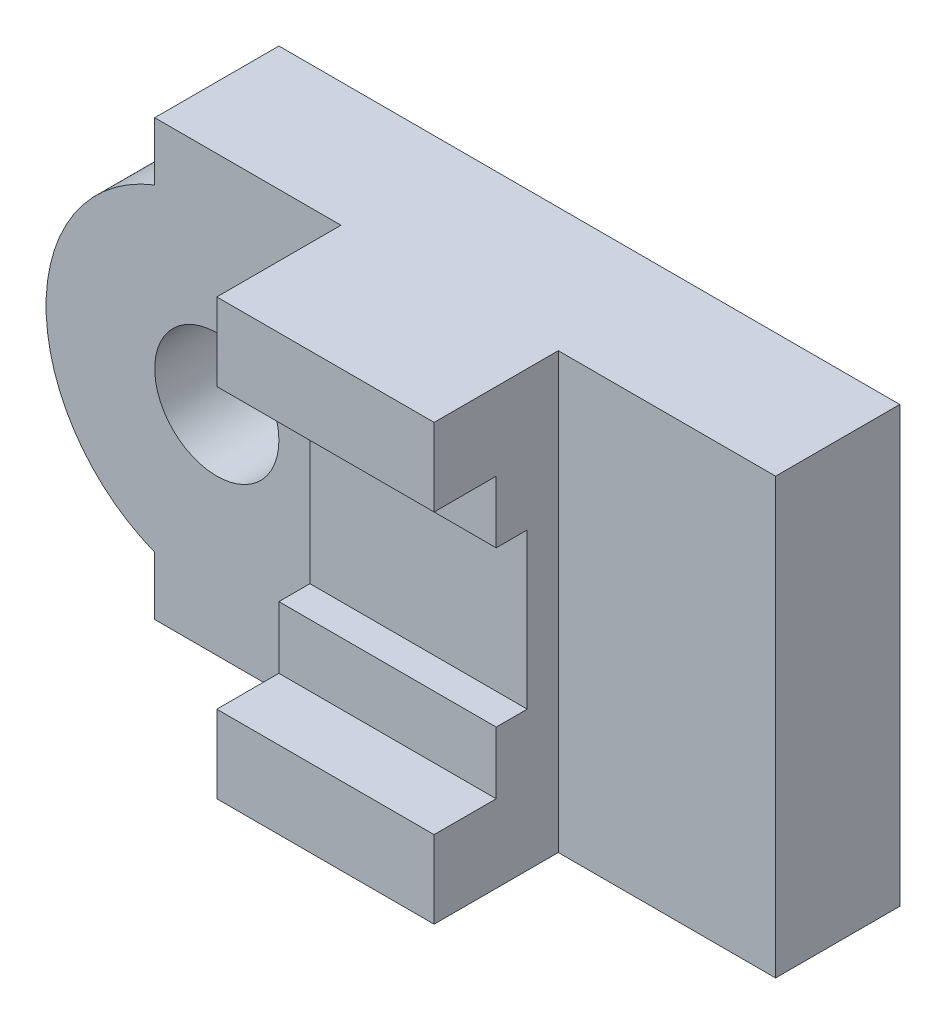
ISO-10303-21;
HEADER;
FILE_DESCRIPTION(('STEP AP214'),'2;1');
FILE_NAME('part.step','',(''),(''),'','','');
FILE_SCHEMA(('AUTOMOTIVE_DESIGN { 1 0 10303 214 1 1 1 1 }'));
ENDSEC;
DATA;
#1=APPLICATION_CONTEXT('core data for automotive mechanical design processes');
#2=APPLICATION_PROTOCOL_DEFINITION('international standard','automotive_design',2000,#1);
#3=PRODUCT_CONTEXT('',#1,'mechanical');
#4=PRODUCT('Part','Part','',(#3));
#5=PRODUCT_RELATED_PRODUCT_CATEGORY('part','',(#4));
#6=PRODUCT_DEFINITION_FORMATION('','',#4);
#7=PRODUCT_DEFINITION_CONTEXT('part definition',#1,'design');
#8=PRODUCT_DEFINITION('design','',#6,#7);
#9=PRODUCT_DEFINITION_SHAPE('','',#8);
#10=(LENGTH_UNIT() NAMED_UNIT(*) SI_UNIT(.MILLI.,.METRE.));
#11=(NAMED_UNIT(*) PLANE_ANGLE_UNIT() SI_UNIT($,.RADIAN.));
#12=(NAMED_UNIT(*) SI_UNIT($,.STERADIAN.) SOLID_ANGLE_UNIT());
#13=UNCERTAINTY_MEASURE_WITH_UNIT(LENGTH_MEASURE(1.E-05),#10,'distance_accuracy_value','');
#14=(GEOMETRIC_REPRESENTATION_CONTEXT(3) GLOBAL_UNCERTAINTY_ASSIGNED_CONTEXT((#13)) GLOBAL_UNIT_ASSIGNED_CONTEXT((#10,
#11,#12)) REPRESENTATION_CONTEXT('',''));
#15=CARTESIAN_POINT('',(0.,0.,0.));
#16=DIRECTION('',(0.,0.,1.));
#17=DIRECTION('',(1.,0.,0.));
#18=AXIS2_PLACEMENT_3D('',#15,#16,#17);
#19=CARTESIAN_POINT('',(0.,0.,20.));
#20=DIRECTION('',(0.,0.,1.));
#21=DIRECTION('',(1.,0.,0.));
#22=AXIS2_PLACEMENT_3D('',#19,#20,#21);
#23=PLANE('',#22);
#24=DIRECTION('',(1.,0.,0.));
#25=VECTOR('',#24,1.);
#26=CARTESIAN_POINT('',(0.,35.,20.));
#27=LINE('',#26,#25);
#28=CARTESIAN_POINT('',(15.,35.,20.));
#29=VERTEX_POINT('',#28);
#30=CARTESIAN_POINT('',(50.,35.,20.));
#31=VERTEX_POINT('',#30);
#32=EDGE_CURVE('E50',#29,#31,#27,.T.);
#33=ORIENTED_EDGE('',*,*,#32,.F.);
#34=DIRECTION('',(0.,-1.,0.));
#35=VECTOR('',#34,1.);
#36=CARTESIAN_POINT('',(15.,0.,20.));
#37=LINE('',#36,#35);
#38=CARTESIAN_POINT('',(15.,-35.,20.));
#39=VERTEX_POINT('',#38);
#40=EDGE_CURVE('E246',#29,#39,#37,.T.);
#41=ORIENTED_EDGE('',*,*,#40,.T.);
#42=DIRECTION('',(1.,0.,0.));
#43=VECTOR('',#42,1.);
#44=CARTESIAN_POINT('',(0.,-35.,20.));
#45=LINE('',#44,#43);
#46=CARTESIAN_POINT('',(50.,-35.,20.));
#47=VERTEX_POINT('',#46);
#48=EDGE_CURVE('E259',#39,#47,#45,.T.);
#49=ORIENTED_EDGE('',*,*,#48,.T.);
#50=DIRECTION('',(0.,1.,0.));
#51=VECTOR('',#50,1.);
#52=CARTESIAN_POINT('',(50.,0.,20.));
#53=LINE('',#52,#51);
#54=EDGE_CURVE('E258',#47,#31,#53,.T.);
#55=ORIENTED_EDGE('',*,*,#54,.T.);
#56=EDGE_LOOP('',(#33,#41,#49,#55));
#57=FACE_BOUND('',#56,.T.);
#58=ADVANCED_FACE('F35',(#57),#23,.T.);
#59=CARTESIAN_POINT('',(-50.,0.,20.));
#60=DIRECTION('',(-1.,0.,0.));
#61=DIRECTION('',(0.,0.,1.));
#62=AXIS2_PLACEMENT_3D('',#59,#60,#61);
#63=PLANE('',#62);
#64=DIRECTION('',(0.,1.,0.));
#65=VECTOR('',#64,1.);
#66=CARTESIAN_POINT('',(-50.,0.,0.));
#67=LINE('',#66,#65);
#68=CARTESIAN_POINT('',(-50.,25.617376914899,0.));
#69=VERTEX_POINT('',#68);
#70=CARTESIAN_POINT('',(-50.,35.,0.));
#71=VERTEX_POINT('',#70);
#72=EDGE_CURVE('E248',#69,#71,#67,.T.);
#73=ORIENTED_EDGE('',*,*,#72,.F.);
#74=DIRECTION('',(0.,0.,-1.));
#75=VECTOR('',#74,1.);
#76=CARTESIAN_POINT('',(-50.,25.617376914899,20.));
#77=LINE('',#76,#75);
#78=CARTESIAN_POINT('',(-50.,25.617376914899,20.));
#79=VERTEX_POINT('',#78);
#80=EDGE_CURVE('E11',#79,#69,#77,.T.);
#81=ORIENTED_EDGE('',*,*,#80,.F.);
#82=DIRECTION('',(0.,1.,0.));
#83=VECTOR('',#82,1.);
#84=CARTESIAN_POINT('',(-50.,0.,20.));
#85=LINE('',#84,#83);
#86=CARTESIAN_POINT('',(-50.,35.,20.));
#87=VERTEX_POINT('',#86);
#88=EDGE_CURVE('E249',#79,#87,#85,.T.);
#89=ORIENTED_EDGE('',*,*,#88,.T.);
#90=DIRECTION('',(0.,0.,-1.));
#91=VECTOR('',#90,1.);
#92=CARTESIAN_POINT('',(-50.,35.,20.));
#93=LINE('',#92,#91);
#94=EDGE_CURVE('E266',#87,#71,#93,.T.);
#95=ORIENTED_EDGE('',*,*,#94,.T.);
#96=EDGE_LOOP('',(#73,#81,#89,#95));
#97=FACE_BOUND('',#96,.T.);
#98=ADVANCED_FACE('F365',(#97),#63,.T.);
#99=CARTESIAN_POINT('',(-40.,0.,20.));
#100=DIRECTION('',(0.,0.,-1.));
#101=DIRECTION('',(-1.,0.,0.));
#102=AXIS2_PLACEMENT_3D('',#99,#100,#101);
#103=CYLINDRICAL_SURFACE('',#102,27.5);
#104=CARTESIAN_POINT('',(-40.,0.,0.));
#105=DIRECTION('',(0.,0.,1.));
#106=DIRECTION('',(1.,0.,0.));
#107=AXIS2_PLACEMENT_3D('',#104,#105,#106);
#108=CIRCLE('',#107,27.5);
#109=CARTESIAN_POINT('',(-50.,-25.617376914899,0.));
#110=VERTEX_POINT('',#109);
#111=EDGE_CURVE('E269',#69,#110,#108,.T.);
#112=ORIENTED_EDGE('',*,*,#111,.T.);
#113=DIRECTION('',(0.,0.,-1.));
#114=VECTOR('',#113,1.);
#115=CARTESIAN_POINT('',(-50.,-25.617376914899,20.));
#116=LINE('',#115,#114);
#117=CARTESIAN_POINT('',(-50.,-25.617376914899,20.));
#118=VERTEX_POINT('',#117);
#119=EDGE_CURVE('E43',#118,#110,#116,.T.);
#120=ORIENTED_EDGE('',*,*,#119,.F.);
#121=CARTESIAN_POINT('',(-40.,0.,20.));
#122=DIRECTION('',(0.,0.,1.));
#123=DIRECTION('',(1.,0.,0.));
#124=AXIS2_PLACEMENT_3D('',#121,#122,#123);
#125=CIRCLE('',#124,27.5);
#126=EDGE_CURVE('E252',#79,#118,#125,.T.);
#127=ORIENTED_EDGE('',*,*,#126,.F.);
#128=ORIENTED_EDGE('',*,*,#80,.T.);
#129=EDGE_LOOP('',(#112,#120,#127,#128));
#130=FACE_BOUND('',#129,.T.);
#131=ADVANCED_FACE('F37',(#130),#103,.T.);
#132=CARTESIAN_POINT('',(-50.,-35.,0.));
#133=VERTEX_POINT('',#132);
#134=EDGE_CURVE('E270',#133,#110,#67,.T.);
#135=ORIENTED_EDGE('',*,*,#134,.F.);
#136=DIRECTION('',(0.,0.,-1.));
#137=VECTOR('',#136,1.);
#138=CARTESIAN_POINT('',(-50.,-35.,20.));
#139=LINE('',#138,#137);
#140=CARTESIAN_POINT('',(-50.,-35.,20.));
#141=VERTEX_POINT('',#140);
#142=EDGE_CURVE('E289',#141,#133,#139,.T.);
#143=ORIENTED_EDGE('',*,*,#142,.F.);
#144=EDGE_CURVE('E254',#141,#118,#85,.T.);
#145=ORIENTED_EDGE('',*,*,#144,.T.);
#146=ORIENTED_EDGE('',*,*,#119,.T.);
#147=EDGE_LOOP('',(#135,#143,#145,#146));
#148=FACE_BOUND('',#147,.T.);
#149=ADVANCED_FACE('F294',(#148),#63,.T.);
#150=CARTESIAN_POINT('',(0.,-35.,20.));
#151=DIRECTION('',(0.,1.,0.));
#152=DIRECTION('',(0.,0.,1.));
#153=AXIS2_PLACEMENT_3D('',#150,#151,#152);
#154=PLANE('',#153);
#155=DIRECTION('',(1.,0.,0.));
#156=VECTOR('',#155,1.);
#157=CARTESIAN_POINT('',(0.,-35.,0.));
#158=LINE('',#157,#156);
#159=CARTESIAN_POINT('',(50.,-35.,0.));
#160=VERTEX_POINT('',#159);
#161=EDGE_CURVE('E273',#133,#160,#158,.T.);
#162=ORIENTED_EDGE('',*,*,#161,.T.);
#163=DIRECTION('',(0.,0.,-1.));
#164=VECTOR('',#163,1.);
#165=CARTESIAN_POINT('',(50.,-35.,20.));
#166=LINE('',#165,#164);
#167=EDGE_CURVE('E286',#47,#160,#166,.T.);
#168=ORIENTED_EDGE('',*,*,#167,.F.);
#169=ORIENTED_EDGE('',*,*,#48,.F.);
#170=DIRECTION('',(0.,0.,1.));
#171=VECTOR('',#170,1.);
#172=CARTESIAN_POINT('',(15.,-35.,0.));
#173=LINE('',#172,#171);
#174=CARTESIAN_POINT('',(15.,-35.,40.));
#175=VERTEX_POINT('',#174);
#176=EDGE_CURVE('E202',#39,#175,#173,.T.);
#177=ORIENTED_EDGE('',*,*,#176,.T.);
#178=DIRECTION('',(-1.,0.,0.));
#179=VECTOR('',#178,1.);
#180=CARTESIAN_POINT('',(15.,-35.,40.));
#181=LINE('',#180,#179);
#182=CARTESIAN_POINT('',(-20.,-35.,40.));
#183=VERTEX_POINT('',#182);
#184=EDGE_CURVE('E234',#175,#183,#181,.T.);
#185=ORIENTED_EDGE('',*,*,#184,.T.);
#186=DIRECTION('',(0.,0.,1.));
#187=VECTOR('',#186,1.);
#188=CARTESIAN_POINT('',(-20.,-35.,0.));
#189=LINE('',#188,#187);
#190=CARTESIAN_POINT('',(-20.,-35.,20.));
#191=VERTEX_POINT('',#190);
#192=EDGE_CURVE('E222',#191,#183,#189,.T.);
#193=ORIENTED_EDGE('',*,*,#192,.F.);
#194=EDGE_CURVE('E256',#141,#191,#45,.T.);
#195=ORIENTED_EDGE('',*,*,#194,.F.);
#196=ORIENTED_EDGE('',*,*,#142,.T.);
#197=EDGE_LOOP('',(#162,#168,#169,#177,#185,#193,#195,#196));
#198=FACE_BOUND('',#197,.T.);
#199=ADVANCED_FACE('F308',(#198),#154,.F.);
#200=CARTESIAN_POINT('',(50.,0.,20.));
#201=DIRECTION('',(-1.,0.,0.));
#202=DIRECTION('',(0.,0.,1.));
#203=AXIS2_PLACEMENT_3D('',#200,#201,#202);
#204=PLANE('',#203);
#205=DIRECTION('',(0.,1.,0.));
#206=VECTOR('',#205,1.);
#207=CARTESIAN_POINT('',(50.,0.,0.));
#208=LINE('',#207,#206);
#209=CARTESIAN_POINT('',(50.,35.,0.));
#210=VERTEX_POINT('',#209);
#211=EDGE_CURVE('E275',#160,#210,#208,.T.);
#212=ORIENTED_EDGE('',*,*,#211,.T.);
#213=DIRECTION('',(0.,0.,-1.));
#214=VECTOR('',#213,1.);
#215=CARTESIAN_POINT('',(50.,35.,20.));
#216=LINE('',#215,#214);
#217=EDGE_CURVE('E283',#31,#210,#216,.T.);
#218=ORIENTED_EDGE('',*,*,#217,.F.);
#219=ORIENTED_EDGE('',*,*,#54,.F.);
#220=ORIENTED_EDGE('',*,*,#167,.T.);
#221=EDGE_LOOP('',(#212,#218,#219,#220));
#222=FACE_BOUND('',#221,.T.);
#223=ADVANCED_FACE('F313',(#222),#204,.F.);
#224=CARTESIAN_POINT('',(0.,35.,20.));
#225=DIRECTION('',(0.,1.,0.));
#226=DIRECTION('',(0.,0.,1.));
#227=AXIS2_PLACEMENT_3D('',#224,#225,#226);
#228=PLANE('',#227);
#229=CARTESIAN_POINT('',(-20.,35.,20.));
#230=VERTEX_POINT('',#229);
#231=EDGE_CURVE('E261',#87,#230,#27,.T.);
#232=ORIENTED_EDGE('',*,*,#231,.T.);
#233=DIRECTION('',(0.,0.,1.));
#234=VECTOR('',#233,1.);
#235=CARTESIAN_POINT('',(-20.,35.,0.));
#236=LINE('',#235,#234);
#237=CARTESIAN_POINT('',(-20.,35.,40.));
#238=VERTEX_POINT('',#237);
#239=EDGE_CURVE('E219',#230,#238,#236,.T.);
#240=ORIENTED_EDGE('',*,*,#239,.T.);
#241=DIRECTION('',(-1.,0.,0.));
#242=VECTOR('',#241,1.);
#243=CARTESIAN_POINT('',(15.,35.,40.));
#244=LINE('',#243,#242);
#245=CARTESIAN_POINT('',(15.,35.,40.));
#246=VERTEX_POINT('',#245);
#247=EDGE_CURVE('E237',#246,#238,#244,.T.);
#248=ORIENTED_EDGE('',*,*,#247,.F.);
#249=DIRECTION('',(0.,0.,1.));
#250=VECTOR('',#249,1.);
#251=CARTESIAN_POINT('',(15.,35.,0.));
#252=LINE('',#251,#250);
#253=EDGE_CURVE('E199',#29,#246,#252,.T.);
#254=ORIENTED_EDGE('',*,*,#253,.F.);
#255=ORIENTED_EDGE('',*,*,#32,.T.);
#256=ORIENTED_EDGE('',*,*,#217,.T.);
#257=DIRECTION('',(1.,0.,0.));
#258=VECTOR('',#257,1.);
#259=CARTESIAN_POINT('',(0.,35.,0.));
#260=LINE('',#259,#258);
#261=EDGE_CURVE('E278',#71,#210,#260,.T.);
#262=ORIENTED_EDGE('',*,*,#261,.F.);
#263=ORIENTED_EDGE('',*,*,#94,.F.);
#264=EDGE_LOOP('',(#232,#240,#248,#254,#255,#256,#262,#263));
#265=FACE_BOUND('',#264,.T.);
#266=ADVANCED_FACE('F335',(#265),#228,.T.);
#267=CARTESIAN_POINT('',(-40.,0.,20.));
#268=DIRECTION('',(0.,0.,-1.));
#269=DIRECTION('',(-1.,0.,0.));
#270=AXIS2_PLACEMENT_3D('',#267,#268,#269);
#271=CYLINDRICAL_SURFACE('',#270,10.);
#272=CARTESIAN_POINT('',(-40.,0.,20.));
#273=DIRECTION('',(0.,0.,1.));
#274=DIRECTION('',(1.,0.,0.));
#275=AXIS2_PLACEMENT_3D('',#272,#273,#274);
#276=CIRCLE('',#275,10.);
#277=CARTESIAN_POINT('',(-30.,0.,20.));
#278=VERTEX_POINT('',#277);
#279=EDGE_CURVE('E263',#278,#278,#276,.T.);
#280=ORIENTED_EDGE('',*,*,#279,.T.);
#281=EDGE_LOOP('',(#280));
#282=FACE_BOUND('',#281,.T.);
#283=CARTESIAN_POINT('',(-40.,0.,0.));
#284=DIRECTION('',(0.,0.,1.));
#285=DIRECTION('',(1.,0.,0.));
#286=AXIS2_PLACEMENT_3D('',#283,#284,#285);
#287=CIRCLE('',#286,10.);
#288=CARTESIAN_POINT('',(-30.,0.,0.));
#289=VERTEX_POINT('',#288);
#290=EDGE_CURVE('E253',#289,#289,#287,.T.);
#291=ORIENTED_EDGE('',*,*,#290,.F.);
#292=EDGE_LOOP('',(#291));
#293=FACE_BOUND('',#292,.T.);
#294=ADVANCED_FACE('F375',(#282,#293),#271,.F.);
#295=DIRECTION('',(0.,-1.,0.));
#296=VECTOR('',#295,1.);
#297=CARTESIAN_POINT('',(-20.,0.,20.));
#298=LINE('',#297,#296);
#299=EDGE_CURVE('E58',#230,#191,#298,.T.);
#300=ORIENTED_EDGE('',*,*,#299,.F.);
#301=ORIENTED_EDGE('',*,*,#231,.F.);
#302=ORIENTED_EDGE('',*,*,#88,.F.);
#303=ORIENTED_EDGE('',*,*,#126,.T.);
#304=ORIENTED_EDGE('',*,*,#144,.F.);
#305=ORIENTED_EDGE('',*,*,#194,.T.);
#306=EDGE_LOOP('',(#300,#301,#302,#303,#304,#305));
#307=FACE_BOUND('',#306,.T.);
#308=ORIENTED_EDGE('',*,*,#279,.F.);
#309=EDGE_LOOP('',(#308));
#310=FACE_BOUND('',#309,.T.);
#311=ADVANCED_FACE('F367',(#307,#310),#23,.T.);
#312=CARTESIAN_POINT('',(0.,0.,0.));
#313=DIRECTION('',(0.,0.,1.));
#314=DIRECTION('',(1.,0.,0.));
#315=AXIS2_PLACEMENT_3D('',#312,#313,#314);
#316=PLANE('',#315);
#317=ORIENTED_EDGE('',*,*,#261,.T.);
#318=ORIENTED_EDGE('',*,*,#211,.F.);
#319=ORIENTED_EDGE('',*,*,#161,.F.);
#320=ORIENTED_EDGE('',*,*,#134,.T.);
#321=ORIENTED_EDGE('',*,*,#111,.F.);
#322=ORIENTED_EDGE('',*,*,#72,.T.);
#323=EDGE_LOOP('',(#317,#318,#319,#320,#321,#322));
#324=FACE_BOUND('',#323,.T.);
#325=ORIENTED_EDGE('',*,*,#290,.T.);
#326=EDGE_LOOP('',(#325));
#327=FACE_BOUND('',#326,.T.);
#328=ADVANCED_FACE('F303',(#324,#327),#316,.F.);
#329=CARTESIAN_POINT('',(15.,0.,25.));
#330=DIRECTION('',(0.,0.,1.));
#331=DIRECTION('',(1.,0.,0.));
#332=AXIS2_PLACEMENT_3D('',#329,#330,#331);
#333=PLANE('',#332);
#334=DIRECTION('',(0.,1.,0.));
#335=VECTOR('',#334,1.);
#336=CARTESIAN_POINT('',(-20.,0.,25.));
#337=LINE('',#336,#335);
#338=CARTESIAN_POINT('',(-20.,-12.5,25.));
#339=VERTEX_POINT('',#338);
#340=CARTESIAN_POINT('',(-20.,12.5,25.));
#341=VERTEX_POINT('',#340);
#342=EDGE_CURVE('E207',#339,#341,#337,.T.);
#343=ORIENTED_EDGE('',*,*,#342,.F.);
#344=DIRECTION('',(-1.,0.,0.));
#345=VECTOR('',#344,1.);
#346=CARTESIAN_POINT('',(15.,-12.5,25.));
#347=LINE('',#346,#345);
#348=CARTESIAN_POINT('',(15.,-12.5,25.));
#349=VERTEX_POINT('',#348);
#350=EDGE_CURVE('E183',#349,#339,#347,.T.);
#351=ORIENTED_EDGE('',*,*,#350,.F.);
#352=DIRECTION('',(0.,1.,0.));
#353=VECTOR('',#352,1.);
#354=CARTESIAN_POINT('',(15.,0.,25.));
#355=LINE('',#354,#353);
#356=CARTESIAN_POINT('',(15.,12.5,25.));
#357=VERTEX_POINT('',#356);
#358=EDGE_CURVE('E177',#349,#357,#355,.T.);
#359=ORIENTED_EDGE('',*,*,#358,.T.);
#360=DIRECTION('',(-1.,0.,0.));
#361=VECTOR('',#360,1.);
#362=CARTESIAN_POINT('',(15.,12.5,25.));
#363=LINE('',#362,#361);
#364=EDGE_CURVE('E160',#357,#341,#363,.T.);
#365=ORIENTED_EDGE('',*,*,#364,.T.);
#366=EDGE_LOOP('',(#343,#351,#359,#365));
#367=FACE_BOUND('',#366,.T.);
#368=ADVANCED_FACE('F182',(#367),#333,.T.);
#369=CARTESIAN_POINT('',(15.,-12.5,0.));
#370=DIRECTION('',(0.,-1.,0.));
#371=DIRECTION('',(0.,0.,-1.));
#372=AXIS2_PLACEMENT_3D('',#369,#370,#371);
#373=PLANE('',#372);
#374=DIRECTION('',(0.,0.,1.));
#375=VECTOR('',#374,1.);
#376=CARTESIAN_POINT('',(-20.,-12.5,0.));
#377=LINE('',#376,#375);
#378=CARTESIAN_POINT('',(-20.,-12.5,30.));
#379=VERTEX_POINT('',#378);
#380=EDGE_CURVE('E185',#339,#379,#377,.T.);
#381=ORIENTED_EDGE('',*,*,#380,.T.);
#382=DIRECTION('',(-1.,0.,0.));
#383=VECTOR('',#382,1.);
#384=CARTESIAN_POINT('',(15.,-12.5,30.));
#385=LINE('',#384,#383);
#386=CARTESIAN_POINT('',(15.,-12.5,30.));
#387=VERTEX_POINT('',#386);
#388=EDGE_CURVE('E228',#387,#379,#385,.T.);
#389=ORIENTED_EDGE('',*,*,#388,.F.);
#390=DIRECTION('',(0.,0.,1.));
#391=VECTOR('',#390,1.);
#392=CARTESIAN_POINT('',(15.,-12.5,0.));
#393=LINE('',#392,#391);
#394=EDGE_CURVE('E171',#349,#387,#393,.T.);
#395=ORIENTED_EDGE('',*,*,#394,.F.);
#396=ORIENTED_EDGE('',*,*,#350,.T.);
#397=EDGE_LOOP('',(#381,#389,#395,#396));
#398=FACE_BOUND('',#397,.T.);
#399=ADVANCED_FACE('F350',(#398),#373,.F.);
#400=CARTESIAN_POINT('',(15.,0.,30.));
#401=DIRECTION('',(0.,0.,1.));
#402=DIRECTION('',(1.,0.,0.));
#403=AXIS2_PLACEMENT_3D('',#400,#401,#402);
#404=PLANE('',#403);
#405=DIRECTION('',(0.,1.,0.));
#406=VECTOR('',#405,1.);
#407=CARTESIAN_POINT('',(-20.,0.,30.));
#408=LINE('',#407,#406);
#409=CARTESIAN_POINT('',(-20.,-22.5,30.));
#410=VERTEX_POINT('',#409);
#411=EDGE_CURVE('E188',#410,#379,#408,.T.);
#412=ORIENTED_EDGE('',*,*,#411,.F.);
#413=DIRECTION('',(-1.,0.,0.));
#414=VECTOR('',#413,1.);
#415=CARTESIAN_POINT('',(15.,-22.5,30.));
#416=LINE('',#415,#414);
#417=CARTESIAN_POINT('',(15.,-22.5,30.));
#418=VERTEX_POINT('',#417);
#419=EDGE_CURVE('E230',#418,#410,#416,.T.);
#420=ORIENTED_EDGE('',*,*,#419,.F.);
#421=DIRECTION('',(0.,1.,0.));
#422=VECTOR('',#421,1.);
#423=CARTESIAN_POINT('',(15.,0.,30.));
#424=LINE('',#423,#422);
#425=EDGE_CURVE('E193',#418,#387,#424,.T.);
#426=ORIENTED_EDGE('',*,*,#425,.T.);
#427=ORIENTED_EDGE('',*,*,#388,.T.);
#428=EDGE_LOOP('',(#412,#420,#426,#427));
#429=FACE_BOUND('',#428,.T.);
#430=ADVANCED_FACE('F353',(#429),#404,.T.);
#431=CARTESIAN_POINT('',(15.,-22.5,0.));
#432=DIRECTION('',(0.,-1.,0.));
#433=DIRECTION('',(0.,0.,-1.));
#434=AXIS2_PLACEMENT_3D('',#431,#432,#433);
#435=PLANE('',#434);
#436=DIRECTION('',(0.,0.,1.));
#437=VECTOR('',#436,1.);
#438=CARTESIAN_POINT('',(-20.,-22.5,0.));
#439=LINE('',#438,#437);
#440=CARTESIAN_POINT('',(-20.,-22.5,40.));
#441=VERTEX_POINT('',#440);
#442=EDGE_CURVE('E224',#410,#441,#439,.T.);
#443=ORIENTED_EDGE('',*,*,#442,.T.);
#444=DIRECTION('',(-1.,0.,0.));
#445=VECTOR('',#444,1.);
#446=CARTESIAN_POINT('',(15.,-22.5,40.));
#447=LINE('',#446,#445);
#448=CARTESIAN_POINT('',(15.,-22.5,40.));
#449=VERTEX_POINT('',#448);
#450=EDGE_CURVE('E232',#449,#441,#447,.T.);
#451=ORIENTED_EDGE('',*,*,#450,.F.);
#452=DIRECTION('',(0.,0.,1.));
#453=VECTOR('',#452,1.);
#454=CARTESIAN_POINT('',(15.,-22.5,0.));
#455=LINE('',#454,#453);
#456=EDGE_CURVE('E204',#418,#449,#455,.T.);
#457=ORIENTED_EDGE('',*,*,#456,.F.);
#458=ORIENTED_EDGE('',*,*,#419,.T.);
#459=EDGE_LOOP('',(#443,#451,#457,#458));
#460=FACE_BOUND('',#459,.T.);
#461=ADVANCED_FACE('F355',(#460),#435,.F.);
#462=CARTESIAN_POINT('',(15.,0.,40.));
#463=DIRECTION('',(0.,0.,1.));
#464=DIRECTION('',(1.,0.,0.));
#465=AXIS2_PLACEMENT_3D('',#462,#463,#464);
#466=PLANE('',#465);
#467=DIRECTION('',(0.,1.,0.));
#468=VECTOR('',#467,1.);
#469=CARTESIAN_POINT('',(-20.,0.,40.));
#470=LINE('',#469,#468);
#471=EDGE_CURVE('E220',#183,#441,#470,.T.);
#472=ORIENTED_EDGE('',*,*,#471,.F.);
#473=ORIENTED_EDGE('',*,*,#184,.F.);
#474=DIRECTION('',(0.,1.,0.));
#475=VECTOR('',#474,1.);
#476=CARTESIAN_POINT('',(15.,0.,40.));
#477=LINE('',#476,#475);
#478=EDGE_CURVE('E200',#175,#449,#477,.T.);
#479=ORIENTED_EDGE('',*,*,#478,.T.);
#480=ORIENTED_EDGE('',*,*,#450,.T.);
#481=EDGE_LOOP('',(#472,#473,#479,#480));
#482=FACE_BOUND('',#481,.T.);
#483=ADVANCED_FACE('F325',(#482),#466,.T.);
#484=CARTESIAN_POINT('',(-20.,22.5,40.));
#485=VERTEX_POINT('',#484);
#486=EDGE_CURVE('E216',#485,#238,#470,.T.);
#487=ORIENTED_EDGE('',*,*,#486,.F.);
#488=DIRECTION('',(-1.,0.,0.));
#489=VECTOR('',#488,1.);
#490=CARTESIAN_POINT('',(15.,22.5,40.));
#491=LINE('',#490,#489);
#492=CARTESIAN_POINT('',(15.,22.5,40.));
#493=VERTEX_POINT('',#492);
#494=EDGE_CURVE('E240',#493,#485,#491,.T.);
#495=ORIENTED_EDGE('',*,*,#494,.F.);
#496=EDGE_CURVE('E196',#493,#246,#477,.T.);
#497=ORIENTED_EDGE('',*,*,#496,.T.);
#498=ORIENTED_EDGE('',*,*,#247,.T.);
#499=EDGE_LOOP('',(#487,#495,#497,#498));
#500=FACE_BOUND('',#499,.T.);
#501=ADVANCED_FACE('F337',(#500),#466,.T.);
#502=CARTESIAN_POINT('',(15.,22.5,0.));
#503=DIRECTION('',(0.,-1.,0.));
#504=DIRECTION('',(0.,0.,-1.));
#505=AXIS2_PLACEMENT_3D('',#502,#503,#504);
#506=PLANE('',#505);
#507=DIRECTION('',(0.,0.,1.));
#508=VECTOR('',#507,1.);
#509=CARTESIAN_POINT('',(-20.,22.5,0.));
#510=LINE('',#509,#508);
#511=CARTESIAN_POINT('',(-20.,22.5,30.));
#512=VERTEX_POINT('',#511);
#513=EDGE_CURVE('E213',#512,#485,#510,.T.);
#514=ORIENTED_EDGE('',*,*,#513,.F.);
#515=DIRECTION('',(-1.,0.,0.));
#516=VECTOR('',#515,1.);
#517=CARTESIAN_POINT('',(15.,22.5,30.));
#518=LINE('',#517,#516);
#519=CARTESIAN_POINT('',(15.,22.5,30.));
#520=VERTEX_POINT('',#519);
#521=EDGE_CURVE('E242',#520,#512,#518,.T.);
#522=ORIENTED_EDGE('',*,*,#521,.F.);
#523=DIRECTION('',(0.,0.,1.));
#524=VECTOR('',#523,1.);
#525=CARTESIAN_POINT('',(15.,22.5,0.));
#526=LINE('',#525,#524);
#527=EDGE_CURVE('E192',#520,#493,#526,.T.);
#528=ORIENTED_EDGE('',*,*,#527,.T.);
#529=ORIENTED_EDGE('',*,*,#494,.T.);
#530=EDGE_LOOP('',(#514,#522,#528,#529));
#531=FACE_BOUND('',#530,.T.);
#532=ADVANCED_FACE('F341',(#531),#506,.T.);
#533=CARTESIAN_POINT('',(-20.,12.5,30.));
#534=VERTEX_POINT('',#533);
#535=EDGE_CURVE('E210',#534,#512,#408,.T.);
#536=ORIENTED_EDGE('',*,*,#535,.F.);
#537=DIRECTION('',(-1.,0.,0.));
#538=VECTOR('',#537,1.);
#539=CARTESIAN_POINT('',(15.,12.5,30.));
#540=LINE('',#539,#538);
#541=CARTESIAN_POINT('',(15.,12.5,30.));
#542=VERTEX_POINT('',#541);
#543=EDGE_CURVE('E170',#542,#534,#540,.T.);
#544=ORIENTED_EDGE('',*,*,#543,.F.);
#545=EDGE_CURVE('E180',#542,#520,#424,.T.);
#546=ORIENTED_EDGE('',*,*,#545,.T.);
#547=ORIENTED_EDGE('',*,*,#521,.T.);
#548=EDGE_LOOP('',(#536,#544,#546,#547));
#549=FACE_BOUND('',#548,.T.);
#550=ADVANCED_FACE('F344',(#549),#404,.T.);
#551=CARTESIAN_POINT('',(15.,12.5,0.));
#552=DIRECTION('',(0.,-1.,0.));
#553=DIRECTION('',(0.,0.,-1.));
#554=AXIS2_PLACEMENT_3D('',#551,#552,#553);
#555=PLANE('',#554);
#556=DIRECTION('',(0.,0.,1.));
#557=VECTOR('',#556,1.);
#558=CARTESIAN_POINT('',(-20.,12.5,0.));
#559=LINE('',#558,#557);
#560=EDGE_CURVE('E165',#341,#534,#559,.T.);
#561=ORIENTED_EDGE('',*,*,#560,.F.);
#562=ORIENTED_EDGE('',*,*,#364,.F.);
#563=DIRECTION('',(0.,0.,1.));
#564=VECTOR('',#563,1.);
#565=CARTESIAN_POINT('',(15.,12.5,0.));
#566=LINE('',#565,#564);
#567=EDGE_CURVE('E163',#357,#542,#566,.T.);
#568=ORIENTED_EDGE('',*,*,#567,.T.);
#569=ORIENTED_EDGE('',*,*,#543,.T.);
#570=EDGE_LOOP('',(#561,#562,#568,#569));
#571=FACE_BOUND('',#570,.T.);
#572=ADVANCED_FACE('F162',(#571),#555,.T.);
#573=CARTESIAN_POINT('',(15.,0.,0.));
#574=DIRECTION('',(-1.,0.,0.));
#575=DIRECTION('',(0.,0.,1.));
#576=AXIS2_PLACEMENT_3D('',#573,#574,#575);
#577=PLANE('',#576);
#578=ORIENTED_EDGE('',*,*,#40,.F.);
#579=ORIENTED_EDGE('',*,*,#253,.T.);
#580=ORIENTED_EDGE('',*,*,#496,.F.);
#581=ORIENTED_EDGE('',*,*,#527,.F.);
#582=ORIENTED_EDGE('',*,*,#545,.F.);
#583=ORIENTED_EDGE('',*,*,#567,.F.);
#584=ORIENTED_EDGE('',*,*,#358,.F.);
#585=ORIENTED_EDGE('',*,*,#394,.T.);
#586=ORIENTED_EDGE('',*,*,#425,.F.);
#587=ORIENTED_EDGE('',*,*,#456,.T.);
#588=ORIENTED_EDGE('',*,*,#478,.F.);
#589=ORIENTED_EDGE('',*,*,#176,.F.);
#590=EDGE_LOOP('',(#578,#579,#580,#581,#582,#583,#584,#585,#586,#587,#588,#589));
#591=FACE_BOUND('',#590,.T.);
#592=ADVANCED_FACE('F176',(#591),#577,.F.);
#593=CARTESIAN_POINT('',(-20.,0.,0.));
#594=DIRECTION('',(-1.,0.,0.));
#595=DIRECTION('',(0.,0.,1.));
#596=AXIS2_PLACEMENT_3D('',#593,#594,#595);
#597=PLANE('',#596);
#598=ORIENTED_EDGE('',*,*,#239,.F.);
#599=ORIENTED_EDGE('',*,*,#299,.T.);
#600=ORIENTED_EDGE('',*,*,#192,.T.);
#601=ORIENTED_EDGE('',*,*,#471,.T.);
#602=ORIENTED_EDGE('',*,*,#442,.F.);
#603=ORIENTED_EDGE('',*,*,#411,.T.);
#604=ORIENTED_EDGE('',*,*,#380,.F.);
#605=ORIENTED_EDGE('',*,*,#342,.T.);
#606=ORIENTED_EDGE('',*,*,#560,.T.);
#607=ORIENTED_EDGE('',*,*,#535,.T.);
#608=ORIENTED_EDGE('',*,*,#513,.T.);
#609=ORIENTED_EDGE('',*,*,#486,.T.);
#610=EDGE_LOOP('',(#598,#599,#600,#601,#602,#603,#604,#605,#606,#607,#608,#609));
#611=FACE_BOUND('',#610,.T.);
#612=ADVANCED_FACE('F330',(#611),#597,.T.);
#613=CLOSED_SHELL('',(#58,#98,#131,#149,#199,#223,#266,#294,#311,#328,#368,#399,#430,#461,#483,
#501,#532,#550,#572,#592,#612));
#614=MANIFOLD_SOLID_BREP('B2',#613);
#615=ADVANCED_BREP_SHAPE_REPRESENTATION('',(#18,#614),#14);
#616=SHAPE_DEFINITION_REPRESENTATION(#9,#615);
ENDSEC;
END-ISO-10303-21;
